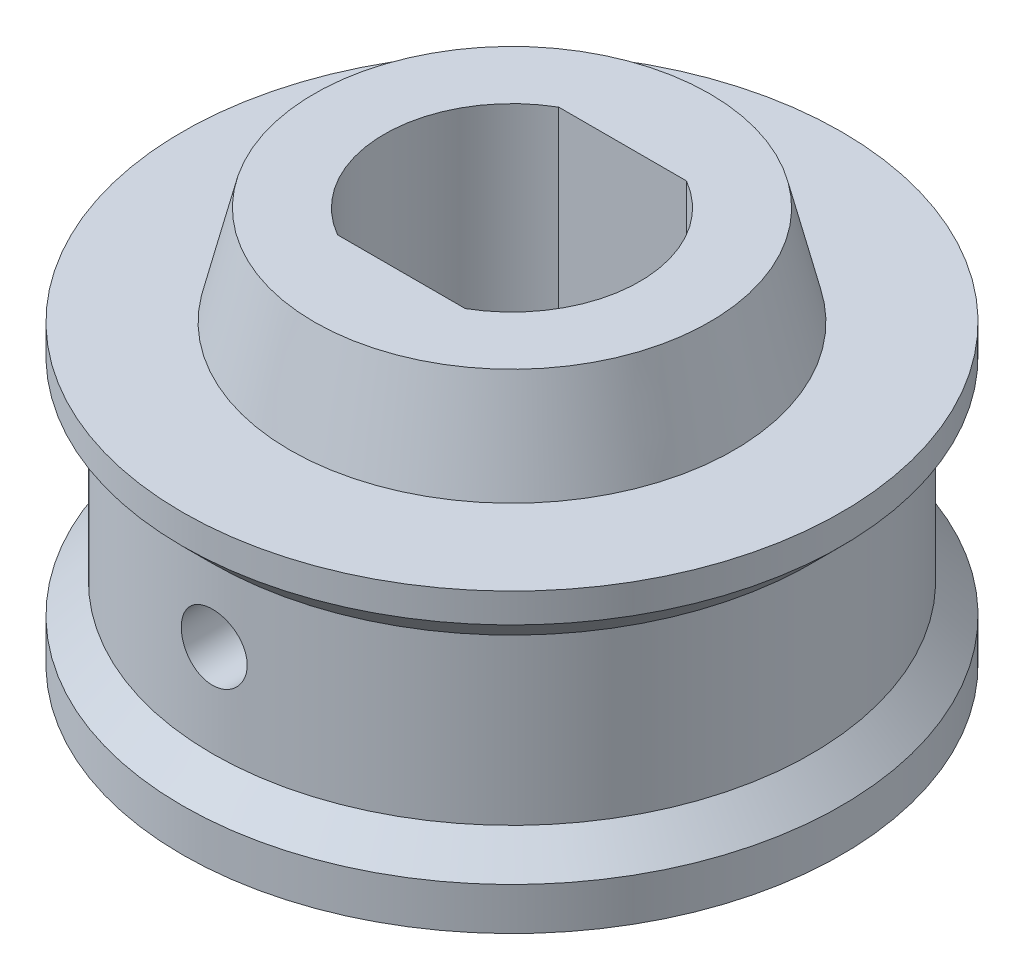
ISO-10303-21;
HEADER;
FILE_DESCRIPTION(('STEP AP214'),'2;1');
FILE_NAME('part.step','',(''),(''),'','','');
FILE_SCHEMA(('AUTOMOTIVE_DESIGN { 1 0 10303 214 1 1 1 1 }'));
ENDSEC;
DATA;
#1=APPLICATION_CONTEXT('core data for automotive mechanical design processes');
#2=APPLICATION_PROTOCOL_DEFINITION('international standard','automotive_design',2000,#1);
#3=PRODUCT_CONTEXT('',#1,'mechanical');
#4=PRODUCT('Part','Part','',(#3));
#5=PRODUCT_RELATED_PRODUCT_CATEGORY('part','',(#4));
#6=PRODUCT_DEFINITION_FORMATION('','',#4);
#7=PRODUCT_DEFINITION_CONTEXT('part definition',#1,'design');
#8=PRODUCT_DEFINITION('design','',#6,#7);
#9=PRODUCT_DEFINITION_SHAPE('','',#8);
#10=(LENGTH_UNIT() NAMED_UNIT(*) SI_UNIT(.MILLI.,.METRE.));
#11=(NAMED_UNIT(*) PLANE_ANGLE_UNIT() SI_UNIT($,.RADIAN.));
#12=(NAMED_UNIT(*) SI_UNIT($,.STERADIAN.) SOLID_ANGLE_UNIT());
#13=UNCERTAINTY_MEASURE_WITH_UNIT(LENGTH_MEASURE(1.E-05),#10,'distance_accuracy_value','');
#14=(GEOMETRIC_REPRESENTATION_CONTEXT(3) GLOBAL_UNCERTAINTY_ASSIGNED_CONTEXT((#13)) GLOBAL_UNIT_ASSIGNED_CONTEXT((#10,
#11,#12)) REPRESENTATION_CONTEXT('',''));
#15=CARTESIAN_POINT('',(0.,0.,0.));
#16=DIRECTION('',(0.,0.,1.));
#17=DIRECTION('',(1.,0.,0.));
#18=AXIS2_PLACEMENT_3D('',#15,#16,#17);
#19=CARTESIAN_POINT('',(0.,0.,0.));
#20=DIRECTION('',(0.,1.,0.));
#21=DIRECTION('',(0.,0.,1.));
#22=AXIS2_PLACEMENT_3D('',#19,#20,#21);
#23=PLANE('',#22);
#24=DIRECTION('',(1.,0.,0.));
#25=VECTOR('',#24,1.);
#26=CARTESIAN_POINT('',(0.,0.,3.3558484396647));
#27=LINE('',#26,#25);
#28=CARTESIAN_POINT('',(-1.9375,0.,3.3558484396647));
#29=VERTEX_POINT('',#28);
#30=CARTESIAN_POINT('',(1.9375,0.,3.3558484396647));
#31=VERTEX_POINT('',#30);
#32=EDGE_CURVE('E120',#29,#31,#27,.T.);
#33=ORIENTED_EDGE('',*,*,#32,.T.);
#34=CARTESIAN_POINT('',(0.,0.,0.));
#35=DIRECTION('',(0.,1.,0.));
#36=DIRECTION('',(0.,0.,1.));
#37=AXIS2_PLACEMENT_3D('',#34,#35,#36);
#38=CIRCLE('',#37,3.875);
#39=CARTESIAN_POINT('',(1.9375,0.,-3.3558484396647));
#40=VERTEX_POINT('',#39);
#41=EDGE_CURVE('E124',#31,#40,#38,.T.);
#42=ORIENTED_EDGE('',*,*,#41,.T.);
#43=DIRECTION('',(-1.,0.,0.));
#44=VECTOR('',#43,1.);
#45=CARTESIAN_POINT('',(0.,0.,-3.3558484396647));
#46=LINE('',#45,#44);
#47=CARTESIAN_POINT('',(-1.9375,0.,-3.3558484396647));
#48=VERTEX_POINT('',#47);
#49=EDGE_CURVE('E111',#40,#48,#46,.T.);
#50=ORIENTED_EDGE('',*,*,#49,.T.);
#51=CARTESIAN_POINT('',(0.,0.,0.));
#52=DIRECTION('',(0.,1.,0.));
#53=DIRECTION('',(0.,0.,1.));
#54=AXIS2_PLACEMENT_3D('',#51,#52,#53);
#55=CIRCLE('',#54,3.875);
#56=EDGE_CURVE('E86',#48,#29,#55,.T.);
#57=ORIENTED_EDGE('',*,*,#56,.T.);
#58=EDGE_LOOP('',(#33,#42,#50,#57));
#59=FACE_BOUND('',#58,.T.);
#60=CARTESIAN_POINT('',(0.,0.,0.));
#61=DIRECTION('',(0.,1.,0.));
#62=DIRECTION('',(0.,0.,1.));
#63=AXIS2_PLACEMENT_3D('',#60,#61,#62);
#64=CIRCLE('',#63,10.);
#65=CARTESIAN_POINT('',(0.,0.,10.));
#66=VERTEX_POINT('',#65);
#67=EDGE_CURVE('E11',#66,#66,#64,.T.);
#68=ORIENTED_EDGE('',*,*,#67,.F.);
#69=EDGE_LOOP('',(#68));
#70=FACE_BOUND('',#69,.T.);
#71=ADVANCED_FACE('F38',(#59,#70),#23,.F.);
#72=CARTESIAN_POINT('',(0.,9.,0.));
#73=DIRECTION('',(0.,1.,0.));
#74=DIRECTION('',(0.,0.,1.));
#75=AXIS2_PLACEMENT_3D('',#72,#73,#74);
#76=CYLINDRICAL_SURFACE('',#75,10.);
#77=CARTESIAN_POINT('',(0.,1.28940344532914,0.));
#78=DIRECTION('',(0.,1.,0.));
#79=DIRECTION('',(0.,0.,1.));
#80=AXIS2_PLACEMENT_3D('',#77,#78,#79);
#81=CIRCLE('',#80,10.);
#82=CARTESIAN_POINT('',(0.,1.28940344532914,10.));
#83=VERTEX_POINT('',#82);
#84=EDGE_CURVE('E47',#83,#83,#81,.T.);
#85=ORIENTED_EDGE('',*,*,#84,.F.);
#86=EDGE_LOOP('',(#85));
#87=FACE_BOUND('',#86,.T.);
#88=ORIENTED_EDGE('',*,*,#67,.T.);
#89=EDGE_LOOP('',(#88));
#90=FACE_BOUND('',#89,.T.);
#91=ADVANCED_FACE('F158',(#87,#90),#76,.T.);
#92=CARTESIAN_POINT('',(0.,1.28940344532914,0.));
#93=DIRECTION('',(0.,-1.,0.));
#94=DIRECTION('',(0.,0.,-1.));
#95=AXIS2_PLACEMENT_3D('',#92,#93,#94);
#96=CONICAL_SURFACE('',#95,10.,0.785398163397448);
#97=CARTESIAN_POINT('',(0.,2.19936791671213,0.));
#98=DIRECTION('',(0.,1.,0.));
#99=DIRECTION('',(0.,0.,1.));
#100=AXIS2_PLACEMENT_3D('',#97,#98,#99);
#101=CIRCLE('',#100,9.09003552861701);
#102=CARTESIAN_POINT('',(0.,2.19936791671213,9.09003552861701));
#103=VERTEX_POINT('',#102);
#104=EDGE_CURVE('E148',#103,#103,#101,.T.);
#105=ORIENTED_EDGE('',*,*,#104,.F.);
#106=EDGE_LOOP('',(#105));
#107=FACE_BOUND('',#106,.T.);
#108=ORIENTED_EDGE('',*,*,#84,.T.);
#109=EDGE_LOOP('',(#108));
#110=FACE_BOUND('',#109,.T.);
#111=ADVANCED_FACE('F156',(#107,#110),#96,.T.);
#112=CARTESIAN_POINT('',(0.,9.,0.));
#113=DIRECTION('',(0.,1.,0.));
#114=DIRECTION('',(0.,0.,1.));
#115=AXIS2_PLACEMENT_3D('',#112,#113,#114);
#116=CYLINDRICAL_SURFACE('',#115,9.09003552861701);
#117=CARTESIAN_POINT('',(0.,4.,9.09003552861701));
#118=CARTESIAN_POINT('',(-0.0559889482290694,4.00000240851229,9.09003482743005));
#119=CARTESIAN_POINT('',(-0.112014155738771,4.00471798364865,9.08951275896766));
#120=CARTESIAN_POINT('',(-0.222509181185054,4.02345693595506,9.08748033124762));
#121=CARTESIAN_POINT('',(-0.276977252602574,4.03749036754109,9.08596890444961));
#122=CARTESIAN_POINT('',(-0.382742090907781,4.07444967829667,9.08212824506646));
#123=CARTESIAN_POINT('',(-0.434040831995247,4.09736995569563,9.07979952774307));
#124=CARTESIAN_POINT('',(-0.532052676682697,4.15144092477509,9.074584157123));
#125=CARTESIAN_POINT('',(-0.57876664279381,4.18259006431414,9.0716976090728));
#126=CARTESIAN_POINT('',(-0.666495047220488,4.25237850848834,9.06567560270368));
#127=CARTESIAN_POINT('',(-0.707486896676945,4.29104613261709,9.062539230615));
#128=CARTESIAN_POINT('',(-0.782413148645631,4.37471331374817,9.05637854900363));
#129=CARTESIAN_POINT('',(-0.816347212741667,4.41971317420372,9.05335424486025));
#130=CARTESIAN_POINT('',(-0.876276347528685,4.51491106895008,9.04775094662268));
#131=CARTESIAN_POINT('',(-0.902250681558257,4.56512223223803,9.04517312316014));
#132=CARTESIAN_POINT('',(-0.945390630196835,4.66922668331826,9.04076631146781));
#133=CARTESIAN_POINT('',(-0.962556505617661,4.72311986203528,9.03893730106655));
#134=CARTESIAN_POINT('',(-0.987524597350163,4.83282637503327,9.03624367526254));
#135=CARTESIAN_POINT('',(-0.99536457059785,4.88863101913845,9.03537517215234));
#136=CARTESIAN_POINT('',(-1.00157506910958,5.00077026759261,9.03468890432087));
#137=CARTESIAN_POINT('',(-0.999945892433994,5.05710485520483,9.03487110652656));
#138=CARTESIAN_POINT('',(-0.98729540857467,5.16844352307471,9.03626210830693));
#139=CARTESIAN_POINT('',(-0.976315462250795,5.22345236727717,9.03746638689456));
#140=CARTESIAN_POINT('',(-0.945339542229622,5.33084181793525,9.04075879409451));
#141=CARTESIAN_POINT('',(-0.92534342380151,5.38322238218577,9.0428469368949));
#142=CARTESIAN_POINT('',(-0.876857571027252,5.48399822937227,9.04767696956458));
#143=CARTESIAN_POINT('',(-0.848349627561256,5.53238468165189,9.05042025842644));
#144=CARTESIAN_POINT('',(-0.783662422051616,5.6237021100446,9.05625034437567));
#145=CARTESIAN_POINT('',(-0.747482888104466,5.6666328927066,9.05933715363656));
#146=CARTESIAN_POINT('',(-0.668249163382321,5.7460605794334,9.06552660886501));
#147=CARTESIAN_POINT('',(-0.625159277995999,5.78252188579081,9.0686292513371));
#148=CARTESIAN_POINT('',(-0.533451566826195,5.84769923732734,9.07448527064358));
#149=CARTESIAN_POINT('',(-0.484833732692775,5.87641527080704,9.07723864695039));
#150=CARTESIAN_POINT('',(-0.38342449869464,5.92528604842526,9.08208709186614));
#151=CARTESIAN_POINT('',(-0.330632144606219,5.94543882840195,9.0841820094151));
#152=CARTESIAN_POINT('',(-0.222384780076328,5.97658413739056,9.08747603072186));
#153=CARTESIAN_POINT('',(-0.166929866140314,5.98757699814243,9.08867516692155));
#154=CARTESIAN_POINT('',(-0.055239638248265,6.00004489647256,9.09003833122575));
#155=CARTESIAN_POINT('',(0.0009901333000931,6.00156902429987,9.09020769802882));
#156=CARTESIAN_POINT('',(0.112904295661744,5.99518535695342,9.08950659304677));
#157=CARTESIAN_POINT('',(0.168588695407996,5.9872777165294,9.08863613832231));
#158=CARTESIAN_POINT('',(0.277688567434677,5.96229573006157,9.08595657403434));
#159=CARTESIAN_POINT('',(0.331109402266172,5.94524452725776,9.08414983468408));
#160=CARTESIAN_POINT('',(0.434332814509301,5.90248332412879,9.07980022744855));
#161=CARTESIAN_POINT('',(0.484135294811787,5.87677309151747,9.07725733981569));
#162=CARTESIAN_POINT('',(0.578929231483252,5.81730301769552,9.0717061986781));
#163=CARTESIAN_POINT('',(0.623900460902039,5.78351110945767,9.0686961085142));
#164=CARTESIAN_POINT('',(0.707550190068842,5.70888266030961,9.06255378805965));
#165=CARTESIAN_POINT('',(0.746228497822435,5.6680459045423,9.05942155404604));
#166=CARTESIAN_POINT('',(0.816366296037717,5.58027199120727,9.05337174824713));
#167=CARTESIAN_POINT('',(0.847793445729141,5.53330891225472,9.05045517614234));
#168=CARTESIAN_POINT('',(0.902314093440786,5.43474253335428,9.04518262004704));
#169=CARTESIAN_POINT('',(0.925407725817956,5.3831393082338,9.04282662701883));
#170=CARTESIAN_POINT('',(0.962552316630411,5.27686591332078,9.03894846602381));
#171=CARTESIAN_POINT('',(0.976622139161657,5.22220240299183,9.03742455959499));
#172=CARTESIAN_POINT('',(0.995380764979267,5.11127105333896,9.03537788491287));
#173=CARTESIAN_POINT('',(1.00006989929282,5.05500327069792,9.03485508133253));
#174=CARTESIAN_POINT('',(0.999928896869268,4.94278215019134,9.03487066268096));
#175=CARTESIAN_POINT('',(0.995149562384542,4.88682874082506,9.03540338428242));
#176=CARTESIAN_POINT('',(0.976314205800922,4.77652513825216,9.03745787955199));
#177=CARTESIAN_POINT('',(0.962258176408,4.72217494630616,9.03897965399776));
#178=CARTESIAN_POINT('',(0.925283166305916,4.61662336009931,9.04283915182707));
#179=CARTESIAN_POINT('',(0.902366042382013,4.56542130876932,9.0451767042596));
#180=CARTESIAN_POINT('',(0.848324479193444,4.46758194994005,9.05040469973229));
#181=CARTESIAN_POINT('',(0.817200029701619,4.42094464812901,9.0532951434614));
#182=CARTESIAN_POINT('',(0.747437239444141,4.3332984334721,9.05932183639798));
#183=CARTESIAN_POINT('',(0.708761005244222,4.29231976278419,9.06245927551434));
#184=CARTESIAN_POINT('',(0.625069612560819,4.21741318632041,9.06861569337111));
#185=CARTESIAN_POINT('',(0.580052947456985,4.1834869611124,9.07163464373745));
#186=CARTESIAN_POINT('',(0.484808152698263,4.12356564681808,9.07722357085941));
#187=CARTESIAN_POINT('',(0.434564858420914,4.09759455011235,9.07979217963078));
#188=CARTESIAN_POINT('',(0.330432638394066,4.05449342781361,9.08417661855751));
#189=CARTESIAN_POINT('',(0.276547843488221,4.03735356853152,9.08599328556365));
#190=CARTESIAN_POINT('',(0.185306221801197,4.01661172854293,9.08821957161247));
#191=CARTESIAN_POINT('',(0.14852989703108,4.01039100480666,9.08889732727797));
#192=CARTESIAN_POINT('',(0.0745077331827135,4.00208434993511,9.08980553793327));
#193=CARTESIAN_POINT('',(0.0372618965716898,3.99999839708123,9.0900359952726));
#194=CARTESIAN_POINT('',(0.,4.,9.09003552861701));
#195=B_SPLINE_CURVE_WITH_KNOTS('',3,(#117,#118,#119,#120,#121,#122,#123,#124,#125,#126,#127,
#128,#129,#130,#131,#132,#133,#134,#135,#136,#137,#138,#139,#140,#141,#142,#143,#144,#145,#146,
#147,#148,#149,#150,#151,#152,#153,#154,#155,#156,#157,#158,#159,#160,#161,#162,#163,#164,#165,
#166,#167,#168,#169,#170,#171,#172,#173,#174,#175,#176,#177,#178,#179,#180,#181,#182,#183,#184,
#185,#186,#187,#188,#189,#190,#191,#192,#193,#194),.UNSPECIFIED.,.T.,.F.,(4,2,2,2,2,2,2,2,2,2,2,
2,2,2,2,2,2,2,2,2,2,2,2,2,2,2,2,2,2,2,2,2,2,2,2,2,2,2,4),(0.,0.167830763784245,0.3358429199952,
0.503749342463276,0.671624116732075,0.840143913824182,1.00867178946841,1.1776350523097,
1.34659331198742,1.51486517186857,1.68313173508615,1.85065785486005,2.01818666391878,
2.18607646249121,2.35397221256192,2.52276493026889,2.69155790293974,2.86038957094822,
3.02921512420376,3.19716467298645,3.36511146621067,3.53263516257566,3.70016335327048,
3.868367636654,4.03657705091829,4.20552278462738,4.37446579439087,4.54305447096972,
4.71163719826011,4.87931785899773,5.04699865157852,5.21464432675477,5.38229021083552,
5.5507999930997,5.71934988461514,5.88840322183908,6.05726790709524,6.1689636186303,
6.28065874346263),.UNSPECIFIED.);
#196=CARTESIAN_POINT('',(0.,4.,9.09003552861701));
#197=VERTEX_POINT('',#196);
#198=EDGE_CURVE('E214',#197,#197,#195,.T.);
#199=ORIENTED_EDGE('',*,*,#198,.T.);
#200=EDGE_LOOP('',(#199));
#201=FACE_BOUND('',#200,.T.);
#202=CARTESIAN_POINT('',(1.,5.,-9.03486280535125));
#203=CARTESIAN_POINT('',(0.999997590460116,5.0559877923984,-9.03486352251933));
#204=CARTESIAN_POINT('',(0.995282203441713,5.1120118476195,-9.03538884098239));
#205=CARTESIAN_POINT('',(0.976544066253394,5.22250447900804,-9.03743287649193));
#206=CARTESIAN_POINT('',(0.962511257640575,5.27697130774934,-9.0389526670759));
#207=CARTESIAN_POINT('',(0.92555376918221,5.38273351807776,-9.04281146431175));
#208=CARTESIAN_POINT('',(0.902634720697794,5.43403088438602,-9.04514995205043));
#209=CARTESIAN_POINT('',(0.848566645866737,5.53204042437418,-9.0503820219356));
#210=CARTESIAN_POINT('',(0.817419168656766,5.57875345886174,-9.05327549956807));
#211=CARTESIAN_POINT('',(0.747632405704276,5.66648291046421,-9.0593056860697));
#212=CARTESIAN_POINT('',(0.708964428895973,5.70747644477296,-9.06244329791028));
#213=CARTESIAN_POINT('',(0.625295834331386,5.78240594991046,-9.06860005867183));
#214=CARTESIAN_POINT('',(0.580294917726715,5.8163415874931,-9.07161920199371));
#215=CARTESIAN_POINT('',(0.485096092839153,5.87627237147539,-9.0772079126602));
#216=CARTESIAN_POINT('',(0.434885237210798,5.90224706915131,-9.07977631511144));
#217=CARTESIAN_POINT('',(0.330781454678336,5.94538777489799,-9.08416428608599));
#218=CARTESIAN_POINT('',(0.276888635060601,5.96255403950803,-9.08598387641762));
#219=CARTESIAN_POINT('',(0.167183240848915,5.98752293887706,-9.08866285680417));
#220=CARTESIAN_POINT('',(0.11137936401677,5.99536336651358,-9.08952612137741));
#221=CARTESIAN_POINT('',(-0.000758380699165696,6.0015750396625,-9.09020838284976));
#222=CARTESIAN_POINT('',(-0.0570922321242063,5.99994657827537,-9.09002741207218));
#223=CARTESIAN_POINT('',(-0.168434044576259,5.98729723058352,-9.0886447504465));
#224=CARTESIAN_POINT('',(-0.223446685249204,5.97631698497534,-9.08744747629344));
#225=CARTESIAN_POINT('',(-0.330843574187618,5.94533915187591,-9.08417176786868));
#226=CARTESIAN_POINT('',(-0.383227782234805,5.92534142645274,-9.08209332011852));
#227=CARTESIAN_POINT('',(-0.48400806083116,5.87685223871632,-9.0772812743468));
#228=CARTESIAN_POINT('',(-0.53239548184891,5.84834294096986,-9.0745463030056));
#229=CARTESIAN_POINT('',(-0.623714274102234,5.7836528409522,-9.06872776425713));
#230=CARTESIAN_POINT('',(-0.666645451414335,5.74747176613587,-9.0656441844671));
#231=CARTESIAN_POINT('',(-0.746071411477056,5.66823694388678,-9.05945484405679));
#232=CARTESIAN_POINT('',(-0.782530907229959,5.62514781758922,-9.0563490524474));
#233=CARTESIAN_POINT('',(-0.847704966649855,5.5334422719228,-9.05048155493405));
#234=CARTESIAN_POINT('',(-0.876419514838663,5.48482584150795,-9.04771984971775));
#235=CARTESIAN_POINT('',(-0.925289222183242,5.38341699727797,-9.0428530896561));
#236=CARTESIAN_POINT('',(-0.945441960170278,5.33062340721635,-9.04074822060009));
#237=CARTESIAN_POINT('',(-0.976586806862622,5.22237335472532,-9.03743722678291));
#238=CARTESIAN_POINT('',(-0.987579254865253,5.16691699100557,-9.03623106873363));
#239=CARTESIAN_POINT('',(-1.00004559524835,5.05522607369378,-9.03485996348559));
#240=CARTESIAN_POINT('',(-1.00156896351077,4.99899710613439,-9.03468960434635));
#241=CARTESIAN_POINT('',(-0.99518406398832,4.88708473387364,-9.03539509383301));
#242=CARTESIAN_POINT('',(-0.987275951005569,4.83140132023306,-9.03627092528743));
#243=CARTESIAN_POINT('',(-0.962294065034768,4.72230642988673,-9.03896518407924));
#244=CARTESIAN_POINT('',(-0.945243896480617,4.668889482851,-9.04078118352508));
#245=CARTESIAN_POINT('',(-0.902486062925927,4.56567338901654,-9.04514919472852));
#246=CARTESIAN_POINT('',(-0.87677815952216,4.51587434188783,-9.04770122675356));
#247=CARTESIAN_POINT('',(-0.817311527950253,4.42108276925642,-9.05326680714653));
#248=CARTESIAN_POINT('',(-0.783520141355335,4.3761108422947,-9.05628220945084));
#249=CARTESIAN_POINT('',(-0.708892324423659,4.29245946297934,-9.06242880099287));
#250=CARTESIAN_POINT('',(-0.668055682666749,4.25378019952914,-9.0655599937031));
#251=CARTESIAN_POINT('',(-0.580281357350589,4.18364030065933,-9.07160180975854));
#252=CARTESIAN_POINT('',(-0.533317731115598,4.15221202952601,-9.07451140678704));
#253=CARTESIAN_POINT('',(-0.434749955228902,4.0976894147747,-9.07976711376801));
#254=CARTESIAN_POINT('',(-0.383145880640012,4.0745949363815,-9.08211323283292));
#255=CARTESIAN_POINT('',(-0.276872993204271,4.03744979373769,-9.08597303829986));
#256=CARTESIAN_POINT('',(-0.222210968873428,4.02337989877629,-9.08748849377408));
#257=CARTESIAN_POINT('',(-0.111282756098509,4.00462062469715,-9.08952351540259));
#258=CARTESIAN_POINT('',(-0.0550166229680049,3.9999309225234,-9.09004311585434));
#259=CARTESIAN_POINT('',(0.0572054443681151,4.00007025355923,-9.09002781193479));
#260=CARTESIAN_POINT('',(0.113161448251164,4.00484917315973,-9.08949845924896));
#261=CARTESIAN_POINT('',(0.223470344303692,4.0236846120038,-9.08745570481419));
#262=CARTESIAN_POINT('',(0.277823236000999,4.03774113397993,-9.08594230277541));
#263=CARTESIAN_POINT('',(0.383380287087122,4.07471816417547,-9.08210089252321));
#264=CARTESIAN_POINT('',(0.434585092047834,4.09763684797466,-9.07977305198458));
#265=CARTESIAN_POINT('',(0.532429308272903,4.15168238455998,-9.07456160387829));
#266=CARTESIAN_POINT('',(0.579068715558885,4.18280924449878,-9.07167799582631));
#267=CARTESIAN_POINT('',(0.666714849809572,4.25257470367491,-9.06565937873552));
#268=CARTESIAN_POINT('',(0.70769177224079,4.29125064386543,-9.06252316747091));
#269=CARTESIAN_POINT('',(0.782594958619151,4.37494072675661,-9.0563628111994));
#270=CARTESIAN_POINT('',(0.816519537393153,4.41995638004506,-9.05333869311894));
#271=CARTESIAN_POINT('',(0.876439059084385,4.51520033274114,-9.04773516626577));
#272=CARTESIAN_POINT('',(0.902409719250767,4.56544397947624,-9.0451571295673));
#273=CARTESIAN_POINT('',(0.945509928081041,4.66957694337202,-9.04075386875746));
#274=CARTESIAN_POINT('',(0.962649316103794,4.72346212723885,-9.03892780729077));
#275=CARTESIAN_POINT('',(0.983389842462278,4.81470249088512,-9.0366893994674));
#276=CARTESIAN_POINT('',(0.98960997488518,4.85147707595692,-9.0360077295341));
#277=CARTESIAN_POINT('',(0.997915844337968,4.92549575547031,-9.03509419504382));
#278=CARTESIAN_POINT('',(1.0000016035607,4.96273984739055,-9.03486232807235));
#279=CARTESIAN_POINT('',(1.,5.,-9.03486280535125));
#280=B_SPLINE_CURVE_WITH_KNOTS('',3,(#202,#203,#204,#205,#206,#207,#208,#209,#210,#211,#212,
#213,#214,#215,#216,#217,#218,#219,#220,#221,#222,#223,#224,#225,#226,#227,#228,#229,#230,#231,
#232,#233,#234,#235,#236,#237,#238,#239,#240,#241,#242,#243,#244,#245,#246,#247,#248,#249,#250,
#251,#252,#253,#254,#255,#256,#257,#258,#259,#260,#261,#262,#263,#264,#265,#266,#267,#268,#269,
#270,#271,#272,#273,#274,#275,#276,#277,#278,#279),.UNSPECIFIED.,.T.,.F.,(4,2,2,2,2,2,2,2,2,2,2,
2,2,2,2,2,2,2,2,2,2,2,2,2,2,2,2,2,2,2,2,2,2,2,2,2,2,2,4),(0.,0.16782729176594,0.335836053456817,
0.503738518705687,0.671609396061003,0.840133737062151,1.00866603331435,1.17762766742808,
1.34658438037587,1.51485403917815,1.68311848938044,1.85065541053925,2.01819489443969,
2.18608794004943,2.35398695117404,2.52277505154502,2.69156348923449,2.86039962638236,
3.02922950955836,3.1971765109867,3.36512075588145,3.53263344872871,3.70015075465703,
3.86835663785856,4.03656756960699,4.20551536889106,4.37446043580616,4.54304428679762,
4.71162233162236,4.87931054379836,5.04699880536384,5.21465256393524,5.38230646860201,
5.55081169605137,5.71935714203276,5.88841213075175,6.05727835740796,6.16896884925406,
6.28065874155651),.UNSPECIFIED.);
#281=CARTESIAN_POINT('',(1.,5.,-9.03486280535125));
#282=VERTEX_POINT('',#281);
#283=EDGE_CURVE('E207',#282,#282,#280,.T.);
#284=ORIENTED_EDGE('',*,*,#283,.T.);
#285=EDGE_LOOP('',(#284));
#286=FACE_BOUND('',#285,.T.);
#287=CARTESIAN_POINT('',(0.,7.19936791671213,0.));
#288=DIRECTION('',(0.,1.,0.));
#289=DIRECTION('',(0.,0.,1.));
#290=AXIS2_PLACEMENT_3D('',#287,#288,#289);
#291=CIRCLE('',#290,9.09003552861701);
#292=CARTESIAN_POINT('',(0.,7.19936791671213,9.09003552861701));
#293=VERTEX_POINT('',#292);
#294=EDGE_CURVE('E144',#293,#293,#291,.T.);
#295=ORIENTED_EDGE('',*,*,#294,.F.);
#296=EDGE_LOOP('',(#295));
#297=FACE_BOUND('',#296,.T.);
#298=ORIENTED_EDGE('',*,*,#104,.T.);
#299=EDGE_LOOP('',(#298));
#300=FACE_BOUND('',#299,.T.);
#301=ADVANCED_FACE('F199',(#201,#286,#297,#300),#116,.T.);
#302=CARTESIAN_POINT('',(0.,7.19936791671213,0.));
#303=DIRECTION('',(0.,1.,0.));
#304=DIRECTION('',(0.,0.,1.));
#305=AXIS2_PLACEMENT_3D('',#302,#303,#304);
#306=CONICAL_SURFACE('',#305,9.09003552861701,0.785398163397449);
#307=CARTESIAN_POINT('',(0.,8.10933238809512,0.));
#308=DIRECTION('',(0.,1.,0.));
#309=DIRECTION('',(0.,0.,1.));
#310=AXIS2_PLACEMENT_3D('',#307,#308,#309);
#311=CIRCLE('',#310,10.);
#312=CARTESIAN_POINT('',(0.,8.10933238809512,10.));
#313=VERTEX_POINT('',#312);
#314=EDGE_CURVE('E140',#313,#313,#311,.T.);
#315=ORIENTED_EDGE('',*,*,#314,.F.);
#316=EDGE_LOOP('',(#315));
#317=FACE_BOUND('',#316,.T.);
#318=ORIENTED_EDGE('',*,*,#294,.T.);
#319=EDGE_LOOP('',(#318));
#320=FACE_BOUND('',#319,.T.);
#321=ADVANCED_FACE('F195',(#317,#320),#306,.T.);
#322=CARTESIAN_POINT('',(0.,9.,0.));
#323=DIRECTION('',(0.,1.,0.));
#324=DIRECTION('',(0.,0.,1.));
#325=AXIS2_PLACEMENT_3D('',#322,#323,#324);
#326=CYLINDRICAL_SURFACE('',#325,10.);
#327=CARTESIAN_POINT('',(0.,9.,0.));
#328=DIRECTION('',(0.,1.,0.));
#329=DIRECTION('',(0.,0.,1.));
#330=AXIS2_PLACEMENT_3D('',#327,#328,#329);
#331=CIRCLE('',#330,10.);
#332=CARTESIAN_POINT('',(0.,9.,10.));
#333=VERTEX_POINT('',#332);
#334=EDGE_CURVE('E136',#333,#333,#331,.T.);
#335=ORIENTED_EDGE('',*,*,#334,.F.);
#336=EDGE_LOOP('',(#335));
#337=FACE_BOUND('',#336,.T.);
#338=ORIENTED_EDGE('',*,*,#314,.T.);
#339=EDGE_LOOP('',(#338));
#340=FACE_BOUND('',#339,.T.);
#341=ADVANCED_FACE('F191',(#337,#340),#326,.T.);
#342=CARTESIAN_POINT('',(10.,9.,0.));
#343=DIRECTION('',(0.,-1.,0.));
#344=DIRECTION('',(0.,0.,-1.));
#345=AXIS2_PLACEMENT_3D('',#342,#343,#344);
#346=PLANE('',#345);
#347=CARTESIAN_POINT('',(0.,9.,0.));
#348=DIRECTION('',(0.,1.,0.));
#349=DIRECTION('',(0.,0.,1.));
#350=AXIS2_PLACEMENT_3D('',#347,#348,#349);
#351=CIRCLE('',#350,6.73564711160439);
#352=CARTESIAN_POINT('',(0.,9.,6.73564711160439));
#353=VERTEX_POINT('',#352);
#354=EDGE_CURVE('E132',#353,#353,#351,.T.);
#355=ORIENTED_EDGE('',*,*,#354,.F.);
#356=EDGE_LOOP('',(#355));
#357=FACE_BOUND('',#356,.T.);
#358=ORIENTED_EDGE('',*,*,#334,.T.);
#359=EDGE_LOOP('',(#358));
#360=FACE_BOUND('',#359,.T.);
#361=ADVANCED_FACE('F187',(#357,#360),#346,.F.);
#362=CARTESIAN_POINT('',(0.,9.,0.));
#363=DIRECTION('',(0.,-1.,0.));
#364=DIRECTION('',(0.,0.,-1.));
#365=AXIS2_PLACEMENT_3D('',#362,#363,#364);
#366=CONICAL_SURFACE('',#365,6.73564711160439,0.240470752049628);
#367=CARTESIAN_POINT('',(0.,12.,0.));
#368=DIRECTION('',(0.,1.,0.));
#369=DIRECTION('',(0.,0.,1.));
#370=AXIS2_PLACEMENT_3D('',#367,#368,#369);
#371=CIRCLE('',#370,6.);
#372=CARTESIAN_POINT('',(0.,12.,6.));
#373=VERTEX_POINT('',#372);
#374=EDGE_CURVE('E128',#373,#373,#371,.T.);
#375=ORIENTED_EDGE('',*,*,#374,.F.);
#376=EDGE_LOOP('',(#375));
#377=FACE_BOUND('',#376,.T.);
#378=ORIENTED_EDGE('',*,*,#354,.T.);
#379=EDGE_LOOP('',(#378));
#380=FACE_BOUND('',#379,.T.);
#381=ADVANCED_FACE('F180',(#377,#380),#366,.T.);
#382=CARTESIAN_POINT('',(0.,12.,0.));
#383=DIRECTION('',(0.,-1.,0.));
#384=DIRECTION('',(0.,0.,-1.));
#385=AXIS2_PLACEMENT_3D('',#382,#383,#384);
#386=PLANE('',#385);
#387=DIRECTION('',(-1.,0.,0.));
#388=VECTOR('',#387,1.);
#389=CARTESIAN_POINT('',(1.9375,12.,-3.3558484396647));
#390=LINE('',#389,#388);
#391=CARTESIAN_POINT('',(1.9375,12.,-3.3558484396647));
#392=VERTEX_POINT('',#391);
#393=CARTESIAN_POINT('',(-1.9375,12.,-3.3558484396647));
#394=VERTEX_POINT('',#393);
#395=EDGE_CURVE('E93',#392,#394,#390,.T.);
#396=ORIENTED_EDGE('',*,*,#395,.F.);
#397=CARTESIAN_POINT('',(0.,12.,0.));
#398=DIRECTION('',(0.,1.,0.));
#399=DIRECTION('',(0.,0.,1.));
#400=AXIS2_PLACEMENT_3D('',#397,#398,#399);
#401=CIRCLE('',#400,3.875);
#402=CARTESIAN_POINT('',(1.9375,12.,3.3558484396647));
#403=VERTEX_POINT('',#402);
#404=EDGE_CURVE('E62',#403,#392,#401,.T.);
#405=ORIENTED_EDGE('',*,*,#404,.F.);
#406=DIRECTION('',(1.,0.,0.));
#407=VECTOR('',#406,1.);
#408=CARTESIAN_POINT('',(-1.9375,12.,3.3558484396647));
#409=LINE('',#408,#407);
#410=CARTESIAN_POINT('',(-1.9375,12.,3.3558484396647));
#411=VERTEX_POINT('',#410);
#412=EDGE_CURVE('E101',#411,#403,#409,.T.);
#413=ORIENTED_EDGE('',*,*,#412,.F.);
#414=CARTESIAN_POINT('',(0.,12.,0.));
#415=DIRECTION('',(0.,1.,0.));
#416=DIRECTION('',(0.,0.,1.));
#417=AXIS2_PLACEMENT_3D('',#414,#415,#416);
#418=CIRCLE('',#417,3.875);
#419=EDGE_CURVE('E83',#394,#411,#418,.T.);
#420=ORIENTED_EDGE('',*,*,#419,.F.);
#421=EDGE_LOOP('',(#396,#405,#413,#420));
#422=FACE_BOUND('',#421,.T.);
#423=ORIENTED_EDGE('',*,*,#374,.T.);
#424=EDGE_LOOP('',(#423));
#425=FACE_BOUND('',#424,.T.);
#426=ADVANCED_FACE('F98',(#422,#425),#386,.F.);
#427=CARTESIAN_POINT('',(0.,-9.,0.));
#428=DIRECTION('',(0.,1.,0.));
#429=DIRECTION('',(0.,0.,1.));
#430=AXIS2_PLACEMENT_3D('',#427,#428,#429);
#431=CYLINDRICAL_SURFACE('',#430,3.875);
#432=DIRECTION('',(0.,1.,0.));
#433=VECTOR('',#432,1.);
#434=CARTESIAN_POINT('',(1.9375,-9.,3.3558484396647));
#435=LINE('',#434,#433);
#436=EDGE_CURVE('E108',#31,#403,#435,.T.);
#437=ORIENTED_EDGE('',*,*,#436,.T.);
#438=ORIENTED_EDGE('',*,*,#404,.T.);
#439=DIRECTION('',(0.,1.,0.));
#440=VECTOR('',#439,1.);
#441=CARTESIAN_POINT('',(1.9375,-9.,-3.3558484396647));
#442=LINE('',#441,#440);
#443=EDGE_CURVE('E90',#40,#392,#442,.T.);
#444=ORIENTED_EDGE('',*,*,#443,.F.);
#445=ORIENTED_EDGE('',*,*,#41,.F.);
#446=EDGE_LOOP('',(#437,#438,#444,#445));
#447=FACE_BOUND('',#446,.T.);
#448=ADVANCED_FACE('F170',(#447),#431,.F.);
#449=CARTESIAN_POINT('',(-1.9375,-9.,3.3558484396647));
#450=DIRECTION('',(0.,0.,1.));
#451=DIRECTION('',(1.,0.,0.));
#452=AXIS2_PLACEMENT_3D('',#449,#450,#451);
#453=PLANE('',#452);
#454=CARTESIAN_POINT('',(0.,5.,3.3558484396647));
#455=DIRECTION('',(0.,0.,1.));
#456=DIRECTION('',(1.,0.,0.));
#457=AXIS2_PLACEMENT_3D('',#454,#455,#456);
#458=CIRCLE('',#457,1.);
#459=CARTESIAN_POINT('',(1.,5.,3.3558484396647));
#460=VERTEX_POINT('',#459);
#461=EDGE_CURVE('E239',#460,#460,#458,.T.);
#462=ORIENTED_EDGE('',*,*,#461,.T.);
#463=EDGE_LOOP('',(#462));
#464=FACE_BOUND('',#463,.T.);
#465=DIRECTION('',(0.,1.,0.));
#466=VECTOR('',#465,1.);
#467=CARTESIAN_POINT('',(-1.9375,-9.,3.3558484396647));
#468=LINE('',#467,#466);
#469=EDGE_CURVE('E89',#29,#411,#468,.T.);
#470=ORIENTED_EDGE('',*,*,#469,.T.);
#471=ORIENTED_EDGE('',*,*,#412,.T.);
#472=ORIENTED_EDGE('',*,*,#436,.F.);
#473=ORIENTED_EDGE('',*,*,#32,.F.);
#474=EDGE_LOOP('',(#470,#471,#472,#473));
#475=FACE_BOUND('',#474,.T.);
#476=ADVANCED_FACE('F169',(#464,#475),#453,.F.);
#477=CARTESIAN_POINT('',(0.,-9.,0.));
#478=DIRECTION('',(0.,1.,0.));
#479=DIRECTION('',(0.,0.,1.));
#480=AXIS2_PLACEMENT_3D('',#477,#478,#479);
#481=CYLINDRICAL_SURFACE('',#480,3.875);
#482=DIRECTION('',(0.,1.,0.));
#483=VECTOR('',#482,1.);
#484=CARTESIAN_POINT('',(-1.9375,-9.,-3.3558484396647));
#485=LINE('',#484,#483);
#486=EDGE_CURVE('E54',#48,#394,#485,.T.);
#487=ORIENTED_EDGE('',*,*,#486,.T.);
#488=ORIENTED_EDGE('',*,*,#419,.T.);
#489=ORIENTED_EDGE('',*,*,#469,.F.);
#490=ORIENTED_EDGE('',*,*,#56,.F.);
#491=EDGE_LOOP('',(#487,#488,#489,#490));
#492=FACE_BOUND('',#491,.T.);
#493=ADVANCED_FACE('F80',(#492),#481,.F.);
#494=CARTESIAN_POINT('',(1.9375,-9.,-3.3558484396647));
#495=DIRECTION('',(0.,0.,-1.));
#496=DIRECTION('',(-1.,0.,0.));
#497=AXIS2_PLACEMENT_3D('',#494,#495,#496);
#498=PLANE('',#497);
#499=CARTESIAN_POINT('',(0.,5.,-3.3558484396647));
#500=DIRECTION('',(0.,0.,-1.));
#501=DIRECTION('',(-1.,0.,0.));
#502=AXIS2_PLACEMENT_3D('',#499,#500,#501);
#503=CIRCLE('',#502,1.);
#504=CARTESIAN_POINT('',(-1.,5.,-3.3558484396647));
#505=VERTEX_POINT('',#504);
#506=EDGE_CURVE('E41',#505,#505,#503,.T.);
#507=ORIENTED_EDGE('',*,*,#506,.T.);
#508=EDGE_LOOP('',(#507));
#509=FACE_BOUND('',#508,.T.);
#510=ORIENTED_EDGE('',*,*,#443,.T.);
#511=ORIENTED_EDGE('',*,*,#395,.T.);
#512=ORIENTED_EDGE('',*,*,#486,.F.);
#513=ORIENTED_EDGE('',*,*,#49,.F.);
#514=EDGE_LOOP('',(#510,#511,#512,#513));
#515=FACE_BOUND('',#514,.T.);
#516=ADVANCED_FACE('F94',(#509,#515),#498,.F.);
#517=CARTESIAN_POINT('',(0.,5.,-10.));
#518=DIRECTION('',(0.,0.,1.));
#519=DIRECTION('',(1.,0.,0.));
#520=AXIS2_PLACEMENT_3D('',#517,#518,#519);
#521=CYLINDRICAL_SURFACE('',#520,1.);
#522=ORIENTED_EDGE('',*,*,#506,.F.);
#523=EDGE_LOOP('',(#522));
#524=FACE_BOUND('',#523,.T.);
#525=ORIENTED_EDGE('',*,*,#283,.F.);
#526=EDGE_LOOP('',(#525));
#527=FACE_BOUND('',#526,.T.);
#528=ADVANCED_FACE('F223',(#524,#527),#521,.F.);
#529=ORIENTED_EDGE('',*,*,#461,.F.);
#530=EDGE_LOOP('',(#529));
#531=FACE_BOUND('',#530,.T.);
#532=ORIENTED_EDGE('',*,*,#198,.F.);
#533=EDGE_LOOP('',(#532));
#534=FACE_BOUND('',#533,.T.);
#535=ADVANCED_FACE('F220',(#531,#534),#521,.F.);
#536=CLOSED_SHELL('',(#71,#91,#111,#301,#321,#341,#361,#381,#426,#448,#476,#493,#516,#528,#535));
#537=MANIFOLD_SOLID_BREP('B2',#536);
#538=ADVANCED_BREP_SHAPE_REPRESENTATION('',(#18,#537),#14);
#539=SHAPE_DEFINITION_REPRESENTATION(#9,#538);
ENDSEC;
END-ISO-10303-21;
